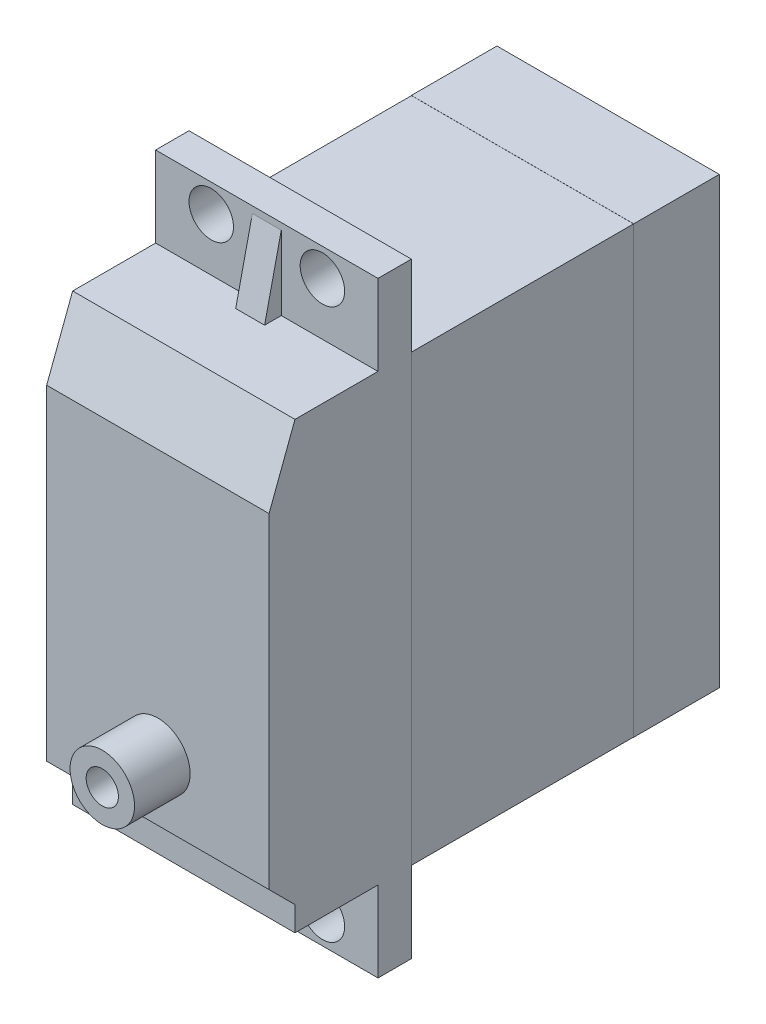
ISO-10303-21;
HEADER;
FILE_DESCRIPTION(('STEP AP214'),'2;1');
FILE_NAME('part.step','',(''),(''),'','','');
FILE_SCHEMA(('AUTOMOTIVE_DESIGN { 1 0 10303 214 1 1 1 1 }'));
ENDSEC;
DATA;
#1=APPLICATION_CONTEXT('core data for automotive mechanical design processes');
#2=APPLICATION_PROTOCOL_DEFINITION('international standard','automotive_design',2000,#1);
#3=PRODUCT_CONTEXT('',#1,'mechanical');
#4=PRODUCT('Part','Part','',(#3));
#5=PRODUCT_RELATED_PRODUCT_CATEGORY('part','',(#4));
#6=PRODUCT_DEFINITION_FORMATION('','',#4);
#7=PRODUCT_DEFINITION_CONTEXT('part definition',#1,'design');
#8=PRODUCT_DEFINITION('design','',#6,#7);
#9=PRODUCT_DEFINITION_SHAPE('','',#8);
#10=(LENGTH_UNIT() NAMED_UNIT(*) SI_UNIT(.MILLI.,.METRE.));
#11=(NAMED_UNIT(*) PLANE_ANGLE_UNIT() SI_UNIT($,.RADIAN.));
#12=(NAMED_UNIT(*) SI_UNIT($,.STERADIAN.) SOLID_ANGLE_UNIT());
#13=UNCERTAINTY_MEASURE_WITH_UNIT(LENGTH_MEASURE(1.E-05),#10,'distance_accuracy_value','');
#14=(GEOMETRIC_REPRESENTATION_CONTEXT(3) GLOBAL_UNCERTAINTY_ASSIGNED_CONTEXT((#13)) GLOBAL_UNIT_ASSIGNED_CONTEXT((#10,
#11,#12)) REPRESENTATION_CONTEXT('',''));
#15=CARTESIAN_POINT('',(0.,0.,0.));
#16=DIRECTION('',(0.,0.,1.));
#17=DIRECTION('',(1.,0.,0.));
#18=AXIS2_PLACEMENT_3D('',#15,#16,#17);
#19=CARTESIAN_POINT('',(-10.,20.,40.5));
#20=DIRECTION('',(0.,-1.,0.));
#21=DIRECTION('',(0.,0.,-1.));
#22=AXIS2_PLACEMENT_3D('',#19,#20,#21);
#23=PLANE('',#22);
#24=DIRECTION('',(0.,0.,-1.));
#25=VECTOR('',#24,1.);
#26=CARTESIAN_POINT('',(-1.3,20.,30.7));
#27=LINE('',#26,#25);
#28=CARTESIAN_POINT('',(-1.3,20.,32.2));
#29=VERTEX_POINT('',#28);
#30=CARTESIAN_POINT('',(-1.3,20.,30.7));
#31=VERTEX_POINT('',#30);
#32=EDGE_CURVE('E265',#29,#31,#27,.T.);
#33=ORIENTED_EDGE('',*,*,#32,.T.);
#34=DIRECTION('',(1.,0.,0.));
#35=VECTOR('',#34,1.);
#36=CARTESIAN_POINT('',(-17.8461774132376,20.,30.7));
#37=LINE('',#36,#35);
#38=CARTESIAN_POINT('',(-10.,20.,30.7));
#39=VERTEX_POINT('',#38);
#40=EDGE_CURVE('E382',#39,#31,#37,.T.);
#41=ORIENTED_EDGE('',*,*,#40,.F.);
#42=DIRECTION('',(0.,0.,-1.));
#43=VECTOR('',#42,1.);
#44=CARTESIAN_POINT('',(-10.,20.,40.5));
#45=LINE('',#44,#43);
#46=CARTESIAN_POINT('',(-10.,20.,38.1665476220844));
#47=VERTEX_POINT('',#46);
#48=EDGE_CURVE('E59',#47,#39,#45,.T.);
#49=ORIENTED_EDGE('',*,*,#48,.F.);
#50=DIRECTION('',(1.,0.,0.));
#51=VECTOR('',#50,1.);
#52=CARTESIAN_POINT('',(-16.6,20.,38.1665476220844));
#53=LINE('',#52,#51);
#54=CARTESIAN_POINT('',(10.,20.,38.1665476220844));
#55=VERTEX_POINT('',#54);
#56=EDGE_CURVE('E338',#47,#55,#53,.T.);
#57=ORIENTED_EDGE('',*,*,#56,.T.);
#58=DIRECTION('',(0.,0.,-1.));
#59=VECTOR('',#58,1.);
#60=CARTESIAN_POINT('',(10.,20.,40.5));
#61=LINE('',#60,#59);
#62=CARTESIAN_POINT('',(10.,20.,30.7));
#63=VERTEX_POINT('',#62);
#64=EDGE_CURVE('E430',#55,#63,#61,.T.);
#65=ORIENTED_EDGE('',*,*,#64,.T.);
#66=CARTESIAN_POINT('',(1.3,20.,30.7));
#67=VERTEX_POINT('',#66);
#68=EDGE_CURVE('E385',#67,#63,#37,.T.);
#69=ORIENTED_EDGE('',*,*,#68,.F.);
#70=DIRECTION('',(0.,0.,-1.));
#71=VECTOR('',#70,1.);
#72=CARTESIAN_POINT('',(1.3,20.,30.7));
#73=LINE('',#72,#71);
#74=CARTESIAN_POINT('',(1.3,20.,32.2));
#75=VERTEX_POINT('',#74);
#76=EDGE_CURVE('E71',#75,#67,#73,.T.);
#77=ORIENTED_EDGE('',*,*,#76,.F.);
#78=DIRECTION('',(1.,0.,0.));
#79=VECTOR('',#78,1.);
#80=CARTESIAN_POINT('',(-1.3,20.,32.2));
#81=LINE('',#80,#79);
#82=EDGE_CURVE('E66',#29,#75,#81,.T.);
#83=ORIENTED_EDGE('',*,*,#82,.F.);
#84=EDGE_LOOP('',(#33,#41,#49,#57,#65,#69,#77,#83));
#85=FACE_BOUND('',#84,.T.);
#86=ADVANCED_FACE('F51',(#85),#23,.F.);
#87=CARTESIAN_POINT('',(-10.,-20.,40.5));
#88=DIRECTION('',(0.,1.,0.));
#89=DIRECTION('',(-1.,0.,0.));
#90=AXIS2_PLACEMENT_3D('',#87,#88,#89);
#91=PLANE('',#90);
#92=DIRECTION('',(0.,0.,1.));
#93=VECTOR('',#92,1.);
#94=CARTESIAN_POINT('',(-1.3,-20.,32.2));
#95=LINE('',#94,#93);
#96=CARTESIAN_POINT('',(-1.3,-20.,30.7));
#97=VERTEX_POINT('',#96);
#98=CARTESIAN_POINT('',(-1.3,-20.,32.2));
#99=VERTEX_POINT('',#98);
#100=EDGE_CURVE('E248',#97,#99,#95,.T.);
#101=ORIENTED_EDGE('',*,*,#100,.T.);
#102=DIRECTION('',(1.,0.,0.));
#103=VECTOR('',#102,1.);
#104=CARTESIAN_POINT('',(-1.3,-20.,32.2));
#105=LINE('',#104,#103);
#106=CARTESIAN_POINT('',(1.3,-20.,32.2));
#107=VERTEX_POINT('',#106);
#108=EDGE_CURVE('E234',#99,#107,#105,.T.);
#109=ORIENTED_EDGE('',*,*,#108,.T.);
#110=DIRECTION('',(0.,0.,1.));
#111=VECTOR('',#110,1.);
#112=CARTESIAN_POINT('',(1.3,-20.,32.2));
#113=LINE('',#112,#111);
#114=CARTESIAN_POINT('',(1.3,-20.,30.7));
#115=VERTEX_POINT('',#114);
#116=EDGE_CURVE('E231',#115,#107,#113,.T.);
#117=ORIENTED_EDGE('',*,*,#116,.F.);
#118=DIRECTION('',(1.,0.,0.));
#119=VECTOR('',#118,1.);
#120=CARTESIAN_POINT('',(-17.8461774132376,-20.,30.7));
#121=LINE('',#120,#119);
#122=CARTESIAN_POINT('',(10.,-20.,30.7));
#123=VERTEX_POINT('',#122);
#124=EDGE_CURVE('E216',#115,#123,#121,.T.);
#125=ORIENTED_EDGE('',*,*,#124,.T.);
#126=DIRECTION('',(0.,0.,-1.));
#127=VECTOR('',#126,1.);
#128=CARTESIAN_POINT('',(10.,-20.,40.5));
#129=LINE('',#128,#127);
#130=CARTESIAN_POINT('',(10.,-20.,38.1665476220844));
#131=VERTEX_POINT('',#130);
#132=EDGE_CURVE('E434',#131,#123,#129,.T.);
#133=ORIENTED_EDGE('',*,*,#132,.F.);
#134=DIRECTION('',(1.,0.,0.));
#135=VECTOR('',#134,1.);
#136=CARTESIAN_POINT('',(-16.6,-20.,38.1665476220844));
#137=LINE('',#136,#135);
#138=CARTESIAN_POINT('',(-10.,-20.,38.1665476220844));
#139=VERTEX_POINT('',#138);
#140=EDGE_CURVE('E318',#139,#131,#137,.T.);
#141=ORIENTED_EDGE('',*,*,#140,.F.);
#142=DIRECTION('',(0.,0.,-1.));
#143=VECTOR('',#142,1.);
#144=CARTESIAN_POINT('',(-10.,-20.,40.5));
#145=LINE('',#144,#143);
#146=CARTESIAN_POINT('',(-10.,-20.,30.7));
#147=VERTEX_POINT('',#146);
#148=EDGE_CURVE('E437',#139,#147,#145,.T.);
#149=ORIENTED_EDGE('',*,*,#148,.T.);
#150=EDGE_CURVE('E227',#147,#97,#121,.T.);
#151=ORIENTED_EDGE('',*,*,#150,.T.);
#152=EDGE_LOOP('',(#101,#109,#117,#125,#133,#141,#149,#151));
#153=FACE_BOUND('',#152,.T.);
#154=ADVANCED_FACE('F232',(#153),#91,.F.);
#155=CARTESIAN_POINT('',(-17.8461774132376,-20.,30.7));
#156=DIRECTION('',(0.,0.,1.));
#157=DIRECTION('',(1.,0.,0.));
#158=AXIS2_PLACEMENT_3D('',#155,#156,#157);
#159=PLANE('',#158);
#160=CARTESIAN_POINT('',(-5.,-24.75,30.7));
#161=DIRECTION('',(0.,0.,1.));
#162=DIRECTION('',(1.,0.,0.));
#163=AXIS2_PLACEMENT_3D('',#160,#161,#162);
#164=CIRCLE('',#163,2.);
#165=CARTESIAN_POINT('',(-3.,-24.75,30.7));
#166=VERTEX_POINT('',#165);
#167=EDGE_CURVE('E361',#166,#166,#164,.T.);
#168=ORIENTED_EDGE('',*,*,#167,.F.);
#169=EDGE_LOOP('',(#168));
#170=FACE_BOUND('',#169,.T.);
#171=CARTESIAN_POINT('',(5.,-24.75,30.7));
#172=DIRECTION('',(0.,0.,1.));
#173=DIRECTION('',(1.,0.,0.));
#174=AXIS2_PLACEMENT_3D('',#171,#172,#173);
#175=CIRCLE('',#174,2.);
#176=CARTESIAN_POINT('',(7.,-24.75,30.7));
#177=VERTEX_POINT('',#176);
#178=EDGE_CURVE('E353',#177,#177,#175,.T.);
#179=ORIENTED_EDGE('',*,*,#178,.F.);
#180=EDGE_LOOP('',(#179));
#181=FACE_BOUND('',#180,.T.);
#182=DIRECTION('',(1.,0.,0.));
#183=VECTOR('',#182,1.);
#184=CARTESIAN_POINT('',(-1.3,-26.65,30.7));
#185=LINE('',#184,#183);
#186=CARTESIAN_POINT('',(-1.3,-26.65,30.7));
#187=VERTEX_POINT('',#186);
#188=CARTESIAN_POINT('',(1.3,-26.65,30.7));
#189=VERTEX_POINT('',#188);
#190=EDGE_CURVE('E253',#187,#189,#185,.T.);
#191=ORIENTED_EDGE('',*,*,#190,.F.);
#192=DIRECTION('',(0.,1.,0.));
#193=VECTOR('',#192,1.);
#194=CARTESIAN_POINT('',(-1.3,-20.,30.7));
#195=LINE('',#194,#193);
#196=EDGE_CURVE('E246',#187,#97,#195,.T.);
#197=ORIENTED_EDGE('',*,*,#196,.T.);
#198=ORIENTED_EDGE('',*,*,#150,.F.);
#199=DIRECTION('',(0.,1.,0.));
#200=VECTOR('',#199,1.);
#201=CARTESIAN_POINT('',(-10.,-20.,30.7));
#202=LINE('',#201,#200);
#203=CARTESIAN_POINT('',(-10.,-27.25,30.7));
#204=VERTEX_POINT('',#203);
#205=EDGE_CURVE('E399',#204,#147,#202,.T.);
#206=ORIENTED_EDGE('',*,*,#205,.F.);
#207=DIRECTION('',(1.,0.,0.));
#208=VECTOR('',#207,1.);
#209=CARTESIAN_POINT('',(-17.8461774132376,-27.25,30.7));
#210=LINE('',#209,#208);
#211=CARTESIAN_POINT('',(10.,-27.25,30.7));
#212=VERTEX_POINT('',#211);
#213=EDGE_CURVE('E406',#204,#212,#210,.T.);
#214=ORIENTED_EDGE('',*,*,#213,.T.);
#215=DIRECTION('',(0.,-1.,0.));
#216=VECTOR('',#215,1.);
#217=CARTESIAN_POINT('',(10.,-20.,30.7));
#218=LINE('',#217,#216);
#219=EDGE_CURVE('E223',#123,#212,#218,.T.);
#220=ORIENTED_EDGE('',*,*,#219,.F.);
#221=ORIENTED_EDGE('',*,*,#124,.F.);
#222=DIRECTION('',(0.,1.,0.));
#223=VECTOR('',#222,1.);
#224=CARTESIAN_POINT('',(1.3,-20.,30.7));
#225=LINE('',#224,#223);
#226=EDGE_CURVE('E220',#189,#115,#225,.T.);
#227=ORIENTED_EDGE('',*,*,#226,.F.);
#228=EDGE_LOOP('',(#191,#197,#198,#206,#214,#220,#221,#227));
#229=FACE_BOUND('',#228,.T.);
#230=ADVANCED_FACE('F218',(#170,#181,#229),#159,.T.);
#231=CARTESIAN_POINT('',(-17.8461774132376,20.,30.7));
#232=DIRECTION('',(0.,0.,1.));
#233=DIRECTION('',(1.,0.,0.));
#234=AXIS2_PLACEMENT_3D('',#231,#232,#233);
#235=PLANE('',#234);
#236=CARTESIAN_POINT('',(5.,24.75,30.7));
#237=DIRECTION('',(0.,0.,1.));
#238=DIRECTION('',(1.,0.,0.));
#239=AXIS2_PLACEMENT_3D('',#236,#237,#238);
#240=CIRCLE('',#239,2.);
#241=CARTESIAN_POINT('',(7.,24.75,30.7));
#242=VERTEX_POINT('',#241);
#243=EDGE_CURVE('E360',#242,#242,#240,.T.);
#244=ORIENTED_EDGE('',*,*,#243,.F.);
#245=EDGE_LOOP('',(#244));
#246=FACE_BOUND('',#245,.T.);
#247=CARTESIAN_POINT('',(-5.,24.75,30.7));
#248=DIRECTION('',(0.,0.,1.));
#249=DIRECTION('',(1.,0.,0.));
#250=AXIS2_PLACEMENT_3D('',#247,#248,#249);
#251=CIRCLE('',#250,2.);
#252=CARTESIAN_POINT('',(-3.,24.75,30.7));
#253=VERTEX_POINT('',#252);
#254=EDGE_CURVE('E364',#253,#253,#251,.T.);
#255=ORIENTED_EDGE('',*,*,#254,.F.);
#256=EDGE_LOOP('',(#255));
#257=FACE_BOUND('',#256,.T.);
#258=ORIENTED_EDGE('',*,*,#40,.T.);
#259=DIRECTION('',(0.,1.,0.));
#260=VECTOR('',#259,1.);
#261=CARTESIAN_POINT('',(-1.3,26.65,30.7));
#262=LINE('',#261,#260);
#263=CARTESIAN_POINT('',(-1.3,26.65,30.7));
#264=VERTEX_POINT('',#263);
#265=EDGE_CURVE('E263',#31,#264,#262,.T.);
#266=ORIENTED_EDGE('',*,*,#265,.T.);
#267=DIRECTION('',(1.,0.,0.));
#268=VECTOR('',#267,1.);
#269=CARTESIAN_POINT('',(-1.3,26.65,30.7));
#270=LINE('',#269,#268);
#271=CARTESIAN_POINT('',(1.3,26.65,30.7));
#272=VERTEX_POINT('',#271);
#273=EDGE_CURVE('E257',#264,#272,#270,.T.);
#274=ORIENTED_EDGE('',*,*,#273,.T.);
#275=DIRECTION('',(0.,1.,0.));
#276=VECTOR('',#275,1.);
#277=CARTESIAN_POINT('',(1.3,26.65,30.7));
#278=LINE('',#277,#276);
#279=EDGE_CURVE('E242',#67,#272,#278,.T.);
#280=ORIENTED_EDGE('',*,*,#279,.F.);
#281=ORIENTED_EDGE('',*,*,#68,.T.);
#282=DIRECTION('',(0.,-1.,0.));
#283=VECTOR('',#282,1.);
#284=CARTESIAN_POINT('',(10.,20.,30.7));
#285=LINE('',#284,#283);
#286=CARTESIAN_POINT('',(10.,27.25,30.7));
#287=VERTEX_POINT('',#286);
#288=EDGE_CURVE('E379',#287,#63,#285,.T.);
#289=ORIENTED_EDGE('',*,*,#288,.F.);
#290=DIRECTION('',(1.,0.,0.));
#291=VECTOR('',#290,1.);
#292=CARTESIAN_POINT('',(-17.8461774132376,27.25,30.7));
#293=LINE('',#292,#291);
#294=CARTESIAN_POINT('',(-10.,27.25,30.7));
#295=VERTEX_POINT('',#294);
#296=EDGE_CURVE('E380',#295,#287,#293,.T.);
#297=ORIENTED_EDGE('',*,*,#296,.F.);
#298=DIRECTION('',(0.,1.,0.));
#299=VECTOR('',#298,1.);
#300=CARTESIAN_POINT('',(-10.,20.,30.7));
#301=LINE('',#300,#299);
#302=EDGE_CURVE('E376',#39,#295,#301,.T.);
#303=ORIENTED_EDGE('',*,*,#302,.F.);
#304=EDGE_LOOP('',(#258,#266,#274,#280,#281,#289,#297,#303));
#305=FACE_BOUND('',#304,.T.);
#306=ADVANCED_FACE('F517',(#246,#257,#305),#235,.T.);
#307=CARTESIAN_POINT('',(-10.,-20.,40.5));
#308=DIRECTION('',(1.,0.,0.));
#309=DIRECTION('',(0.,0.,-1.));
#310=AXIS2_PLACEMENT_3D('',#307,#308,#309);
#311=PLANE('',#310);
#312=DIRECTION('',(0.,-1.,0.));
#313=VECTOR('',#312,1.);
#314=CARTESIAN_POINT('',(-10.,20.,27.7));
#315=LINE('',#314,#313);
#316=CARTESIAN_POINT('',(-10.,27.25,27.7));
#317=VERTEX_POINT('',#316);
#318=CARTESIAN_POINT('',(-10.,-27.25,27.7));
#319=VERTEX_POINT('',#318);
#320=EDGE_CURVE('E374',#317,#319,#315,.T.);
#321=ORIENTED_EDGE('',*,*,#320,.T.);
#322=DIRECTION('',(0.,0.,1.));
#323=VECTOR('',#322,1.);
#324=CARTESIAN_POINT('',(-10.,-27.25,30.7));
#325=LINE('',#324,#323);
#326=EDGE_CURVE('E397',#319,#204,#325,.T.);
#327=ORIENTED_EDGE('',*,*,#326,.T.);
#328=ORIENTED_EDGE('',*,*,#205,.T.);
#329=ORIENTED_EDGE('',*,*,#148,.F.);
#330=DIRECTION('',(0.,-1.,0.));
#331=VECTOR('',#330,1.);
#332=CARTESIAN_POINT('',(-10.,1.20301677890033E-13,38.1665476220843));
#333=LINE('',#332,#331);
#334=CARTESIAN_POINT('',(-10.,-17.7985874405663,38.1665476220844));
#335=VERTEX_POINT('',#334);
#336=EDGE_CURVE('E315',#335,#139,#333,.T.);
#337=ORIENTED_EDGE('',*,*,#336,.F.);
#338=DIRECTION('',(0.,-0.707106781186546,-0.707106781186549));
#339=VECTOR('',#338,1.);
#340=CARTESIAN_POINT('',(-10.,-27.9825675313254,27.9825675313253));
#341=LINE('',#340,#339);
#342=CARTESIAN_POINT('',(-10.,-15.4651350626507,40.5));
#343=VERTEX_POINT('',#342);
#344=EDGE_CURVE('E317',#343,#335,#341,.T.);
#345=ORIENTED_EDGE('',*,*,#344,.F.);
#346=DIRECTION('',(0.,-1.,0.));
#347=VECTOR('',#346,1.);
#348=CARTESIAN_POINT('',(-10.,-20.,40.5));
#349=LINE('',#348,#347);
#350=CARTESIAN_POINT('',(-10.,13.826265311823,40.5));
#351=VERTEX_POINT('',#350);
#352=EDGE_CURVE('E412',#351,#343,#349,.T.);
#353=ORIENTED_EDGE('',*,*,#352,.F.);
#354=DIRECTION('',(0.,0.935414346693486,-0.353553390593273));
#355=VECTOR('',#354,1.);
#356=CARTESIAN_POINT('',(-10.,15.1223991762423,40.0101074469853));
#357=LINE('',#356,#355);
#358=EDGE_CURVE('E323',#351,#47,#357,.T.);
#359=ORIENTED_EDGE('',*,*,#358,.T.);
#360=ORIENTED_EDGE('',*,*,#48,.T.);
#361=ORIENTED_EDGE('',*,*,#302,.T.);
#362=DIRECTION('',(0.,0.,-1.));
#363=VECTOR('',#362,1.);
#364=CARTESIAN_POINT('',(-10.,27.25,30.7));
#365=LINE('',#364,#363);
#366=EDGE_CURVE('E395',#295,#317,#365,.T.);
#367=ORIENTED_EDGE('',*,*,#366,.T.);
#368=EDGE_LOOP('',(#321,#327,#328,#329,#337,#345,#353,#359,#360,#361,#367));
#369=FACE_BOUND('',#368,.T.);
#370=ADVANCED_FACE('F509',(#369),#311,.F.);
#371=CARTESIAN_POINT('',(10.,-20.,40.5));
#372=DIRECTION('',(-1.,0.,0.));
#373=DIRECTION('',(0.,0.,1.));
#374=AXIS2_PLACEMENT_3D('',#371,#372,#373);
#375=PLANE('',#374);
#376=DIRECTION('',(0.,0.,-1.));
#377=VECTOR('',#376,1.);
#378=CARTESIAN_POINT('',(10.,-27.25,30.7));
#379=LINE('',#378,#377);
#380=CARTESIAN_POINT('',(10.,-27.25,27.7));
#381=VERTEX_POINT('',#380);
#382=EDGE_CURVE('E228',#212,#381,#379,.T.);
#383=ORIENTED_EDGE('',*,*,#382,.T.);
#384=DIRECTION('',(0.,1.,0.));
#385=VECTOR('',#384,1.);
#386=CARTESIAN_POINT('',(10.,20.,27.7));
#387=LINE('',#386,#385);
#388=CARTESIAN_POINT('',(10.,27.25,27.7));
#389=VERTEX_POINT('',#388);
#390=EDGE_CURVE('E391',#381,#389,#387,.T.);
#391=ORIENTED_EDGE('',*,*,#390,.T.);
#392=DIRECTION('',(0.,0.,1.));
#393=VECTOR('',#392,1.);
#394=CARTESIAN_POINT('',(10.,27.25,30.7));
#395=LINE('',#394,#393);
#396=EDGE_CURVE('E388',#389,#287,#395,.T.);
#397=ORIENTED_EDGE('',*,*,#396,.T.);
#398=ORIENTED_EDGE('',*,*,#288,.T.);
#399=ORIENTED_EDGE('',*,*,#64,.F.);
#400=DIRECTION('',(0.,-0.935414346693486,0.353553390593273));
#401=VECTOR('',#400,1.);
#402=CARTESIAN_POINT('',(10.,15.1223991762423,40.0101074469853));
#403=LINE('',#402,#401);
#404=CARTESIAN_POINT('',(10.,13.826265311823,40.5));
#405=VERTEX_POINT('',#404);
#406=EDGE_CURVE('E314',#55,#405,#403,.T.);
#407=ORIENTED_EDGE('',*,*,#406,.T.);
#408=DIRECTION('',(0.,1.,0.));
#409=VECTOR('',#408,1.);
#410=CARTESIAN_POINT('',(10.,-20.,40.5));
#411=LINE('',#410,#409);
#412=CARTESIAN_POINT('',(10.,-15.4651350626507,40.5));
#413=VERTEX_POINT('',#412);
#414=EDGE_CURVE('E415',#413,#405,#411,.T.);
#415=ORIENTED_EDGE('',*,*,#414,.F.);
#416=DIRECTION('',(0.,0.707106781186546,0.707106781186549));
#417=VECTOR('',#416,1.);
#418=CARTESIAN_POINT('',(10.,-27.9825675313254,27.9825675313253));
#419=LINE('',#418,#417);
#420=CARTESIAN_POINT('',(10.,-17.7985874405663,38.1665476220844));
#421=VERTEX_POINT('',#420);
#422=EDGE_CURVE('E322',#421,#413,#419,.T.);
#423=ORIENTED_EDGE('',*,*,#422,.F.);
#424=DIRECTION('',(0.,1.,0.));
#425=VECTOR('',#424,1.);
#426=CARTESIAN_POINT('',(10.,1.20301677890033E-13,38.1665476220843));
#427=LINE('',#426,#425);
#428=EDGE_CURVE('E319',#131,#421,#427,.T.);
#429=ORIENTED_EDGE('',*,*,#428,.F.);
#430=ORIENTED_EDGE('',*,*,#132,.T.);
#431=ORIENTED_EDGE('',*,*,#219,.T.);
#432=EDGE_LOOP('',(#383,#391,#397,#398,#399,#407,#415,#423,#429,#430,#431));
#433=FACE_BOUND('',#432,.T.);
#434=ADVANCED_FACE('F502',(#433),#375,.F.);
#435=CARTESIAN_POINT('',(0.,0.,40.5));
#436=DIRECTION('',(0.,0.,1.));
#437=DIRECTION('',(1.,0.,0.));
#438=AXIS2_PLACEMENT_3D('',#435,#436,#437);
#439=PLANE('',#438);
#440=DIRECTION('',(1.,0.,0.));
#441=VECTOR('',#440,1.);
#442=CARTESIAN_POINT('',(-16.6,-15.4651350626507,40.5));
#443=LINE('',#442,#441);
#444=EDGE_CURVE('E327',#343,#413,#443,.T.);
#445=ORIENTED_EDGE('',*,*,#444,.T.);
#446=ORIENTED_EDGE('',*,*,#414,.T.);
#447=DIRECTION('',(1.,0.,0.));
#448=VECTOR('',#447,1.);
#449=CARTESIAN_POINT('',(-16.6,13.826265311823,40.5));
#450=LINE('',#449,#448);
#451=EDGE_CURVE('E335',#351,#405,#450,.T.);
#452=ORIENTED_EDGE('',*,*,#451,.F.);
#453=ORIENTED_EDGE('',*,*,#352,.T.);
#454=EDGE_LOOP('',(#445,#446,#452,#453));
#455=FACE_BOUND('',#454,.T.);
#456=CARTESIAN_POINT('',(0.,-10.,40.5));
#457=DIRECTION('',(0.,0.,1.));
#458=DIRECTION('',(1.,0.,0.));
#459=AXIS2_PLACEMENT_3D('',#456,#457,#458);
#460=CIRCLE('',#459,2.9);
#461=CARTESIAN_POINT('',(2.9,-10.,40.5));
#462=VERTEX_POINT('',#461);
#463=EDGE_CURVE('E332',#462,#462,#460,.T.);
#464=ORIENTED_EDGE('',*,*,#463,.F.);
#465=EDGE_LOOP('',(#464));
#466=FACE_BOUND('',#465,.T.);
#467=ADVANCED_FACE('F522',(#455,#466),#439,.T.);
#468=CARTESIAN_POINT('',(-17.8461774132376,-27.25,30.7));
#469=DIRECTION('',(0.,-1.,0.));
#470=DIRECTION('',(0.,0.,-1.));
#471=AXIS2_PLACEMENT_3D('',#468,#469,#470);
#472=PLANE('',#471);
#473=ORIENTED_EDGE('',*,*,#326,.F.);
#474=DIRECTION('',(1.,0.,0.));
#475=VECTOR('',#474,1.);
#476=CARTESIAN_POINT('',(-17.8461774132376,-27.25,27.7));
#477=LINE('',#476,#475);
#478=EDGE_CURVE('E400',#319,#381,#477,.T.);
#479=ORIENTED_EDGE('',*,*,#478,.T.);
#480=ORIENTED_EDGE('',*,*,#382,.F.);
#481=ORIENTED_EDGE('',*,*,#213,.F.);
#482=EDGE_LOOP('',(#473,#479,#480,#481));
#483=FACE_BOUND('',#482,.T.);
#484=ADVANCED_FACE('F534',(#483),#472,.T.);
#485=CARTESIAN_POINT('',(-17.8461774132376,27.25,30.7));
#486=DIRECTION('',(0.,1.,0.));
#487=DIRECTION('',(0.,0.,1.));
#488=AXIS2_PLACEMENT_3D('',#485,#486,#487);
#489=PLANE('',#488);
#490=ORIENTED_EDGE('',*,*,#366,.F.);
#491=ORIENTED_EDGE('',*,*,#296,.T.);
#492=ORIENTED_EDGE('',*,*,#396,.F.);
#493=DIRECTION('',(1.,0.,0.));
#494=VECTOR('',#493,1.);
#495=CARTESIAN_POINT('',(-17.8461774132376,27.25,27.7));
#496=LINE('',#495,#494);
#497=EDGE_CURVE('E377',#317,#389,#496,.T.);
#498=ORIENTED_EDGE('',*,*,#497,.F.);
#499=EDGE_LOOP('',(#490,#491,#492,#498));
#500=FACE_BOUND('',#499,.T.);
#501=ADVANCED_FACE('F739',(#500),#489,.T.);
#502=CARTESIAN_POINT('',(-17.8461774132376,20.,27.7));
#503=DIRECTION('',(0.,0.,-1.));
#504=DIRECTION('',(-1.,0.,0.));
#505=AXIS2_PLACEMENT_3D('',#502,#503,#504);
#506=PLANE('',#505);
#507=CARTESIAN_POINT('',(5.,24.75,27.7));
#508=DIRECTION('',(0.,0.,-1.));
#509=DIRECTION('',(-1.,0.,0.));
#510=AXIS2_PLACEMENT_3D('',#507,#508,#509);
#511=CIRCLE('',#510,2.);
#512=CARTESIAN_POINT('',(3.,24.75,27.7));
#513=VERTEX_POINT('',#512);
#514=EDGE_CURVE('E357',#513,#513,#511,.F.);
#515=ORIENTED_EDGE('',*,*,#514,.T.);
#516=EDGE_LOOP('',(#515));
#517=FACE_BOUND('',#516,.T.);
#518=CARTESIAN_POINT('',(-5.,24.75,27.7));
#519=DIRECTION('',(0.,0.,-1.));
#520=DIRECTION('',(-1.,0.,0.));
#521=AXIS2_PLACEMENT_3D('',#518,#519,#520);
#522=CIRCLE('',#521,2.);
#523=CARTESIAN_POINT('',(-7.,24.75,27.7));
#524=VERTEX_POINT('',#523);
#525=EDGE_CURVE('E371',#524,#524,#522,.F.);
#526=ORIENTED_EDGE('',*,*,#525,.T.);
#527=EDGE_LOOP('',(#526));
#528=FACE_BOUND('',#527,.T.);
#529=ORIENTED_EDGE('',*,*,#320,.F.);
#530=ORIENTED_EDGE('',*,*,#497,.T.);
#531=ORIENTED_EDGE('',*,*,#390,.F.);
#532=ORIENTED_EDGE('',*,*,#478,.F.);
#533=EDGE_LOOP('',(#529,#530,#531,#532));
#534=FACE_BOUND('',#533,.T.);
#535=DIRECTION('',(0.,1.,0.));
#536=VECTOR('',#535,1.);
#537=CARTESIAN_POINT('',(-9.99,-19.99,27.7));
#538=LINE('',#537,#536);
#539=CARTESIAN_POINT('',(-9.99,-19.99,27.7));
#540=VERTEX_POINT('',#539);
#541=CARTESIAN_POINT('',(-9.99,19.99,27.7));
#542=VERTEX_POINT('',#541);
#543=EDGE_CURVE('E255',#540,#542,#538,.T.);
#544=ORIENTED_EDGE('',*,*,#543,.F.);
#545=DIRECTION('',(-1.,0.,0.));
#546=VECTOR('',#545,1.);
#547=CARTESIAN_POINT('',(9.99,-19.99,27.7));
#548=LINE('',#547,#546);
#549=CARTESIAN_POINT('',(9.99,-19.99,27.7));
#550=VERTEX_POINT('',#549);
#551=EDGE_CURVE('E275',#550,#540,#548,.T.);
#552=ORIENTED_EDGE('',*,*,#551,.F.);
#553=DIRECTION('',(0.,-1.,0.));
#554=VECTOR('',#553,1.);
#555=CARTESIAN_POINT('',(9.99,19.99,27.7));
#556=LINE('',#555,#554);
#557=CARTESIAN_POINT('',(9.99,19.99,27.7));
#558=VERTEX_POINT('',#557);
#559=EDGE_CURVE('E288',#558,#550,#556,.T.);
#560=ORIENTED_EDGE('',*,*,#559,.F.);
#561=DIRECTION('',(1.,0.,0.));
#562=VECTOR('',#561,1.);
#563=CARTESIAN_POINT('',(-9.99,19.99,27.7));
#564=LINE('',#563,#562);
#565=EDGE_CURVE('E285',#542,#558,#564,.T.);
#566=ORIENTED_EDGE('',*,*,#565,.F.);
#567=EDGE_LOOP('',(#544,#552,#560,#566));
#568=FACE_BOUND('',#567,.T.);
#569=CARTESIAN_POINT('',(-5.,-24.75,27.7));
#570=DIRECTION('',(0.,0.,-1.));
#571=DIRECTION('',(-1.,0.,0.));
#572=AXIS2_PLACEMENT_3D('',#569,#570,#571);
#573=CIRCLE('',#572,2.);
#574=CARTESIAN_POINT('',(-7.,-24.75,27.7));
#575=VERTEX_POINT('',#574);
#576=EDGE_CURVE('E356',#575,#575,#573,.F.);
#577=ORIENTED_EDGE('',*,*,#576,.T.);
#578=EDGE_LOOP('',(#577));
#579=FACE_BOUND('',#578,.T.);
#580=CARTESIAN_POINT('',(5.,-24.75,27.7));
#581=DIRECTION('',(0.,0.,-1.));
#582=DIRECTION('',(-1.,0.,0.));
#583=AXIS2_PLACEMENT_3D('',#580,#581,#582);
#584=CIRCLE('',#583,2.);
#585=CARTESIAN_POINT('',(3.,-24.75,27.7));
#586=VERTEX_POINT('',#585);
#587=EDGE_CURVE('E348',#586,#586,#584,.F.);
#588=ORIENTED_EDGE('',*,*,#587,.T.);
#589=EDGE_LOOP('',(#588));
#590=FACE_BOUND('',#589,.T.);
#591=ADVANCED_FACE('F482',(#517,#528,#534,#568,#579,#590),#506,.T.);
#592=CARTESIAN_POINT('',(-5.,24.75,22.0431457505076));
#593=DIRECTION('',(0.,0.,1.));
#594=DIRECTION('',(1.,0.,0.));
#595=AXIS2_PLACEMENT_3D('',#592,#593,#594);
#596=CYLINDRICAL_SURFACE('',#595,2.);
#597=ORIENTED_EDGE('',*,*,#254,.T.);
#598=EDGE_LOOP('',(#597));
#599=FACE_BOUND('',#598,.T.);
#600=ORIENTED_EDGE('',*,*,#525,.F.);
#601=EDGE_LOOP('',(#600));
#602=FACE_BOUND('',#601,.T.);
#603=ADVANCED_FACE('F738',(#599,#602),#596,.F.);
#604=CARTESIAN_POINT('',(5.,24.75,22.0431457505076));
#605=DIRECTION('',(0.,0.,1.));
#606=DIRECTION('',(1.,0.,0.));
#607=AXIS2_PLACEMENT_3D('',#604,#605,#606);
#608=CYLINDRICAL_SURFACE('',#607,2.);
#609=ORIENTED_EDGE('',*,*,#243,.T.);
#610=EDGE_LOOP('',(#609));
#611=FACE_BOUND('',#610,.T.);
#612=ORIENTED_EDGE('',*,*,#514,.F.);
#613=EDGE_LOOP('',(#612));
#614=FACE_BOUND('',#613,.T.);
#615=ADVANCED_FACE('F883',(#611,#614),#608,.F.);
#616=CARTESIAN_POINT('',(5.,-24.75,22.0431457505076));
#617=DIRECTION('',(0.,0.,1.));
#618=DIRECTION('',(1.,0.,0.));
#619=AXIS2_PLACEMENT_3D('',#616,#617,#618);
#620=CYLINDRICAL_SURFACE('',#619,2.);
#621=ORIENTED_EDGE('',*,*,#178,.T.);
#622=EDGE_LOOP('',(#621));
#623=FACE_BOUND('',#622,.T.);
#624=ORIENTED_EDGE('',*,*,#587,.F.);
#625=EDGE_LOOP('',(#624));
#626=FACE_BOUND('',#625,.T.);
#627=ADVANCED_FACE('F871',(#623,#626),#620,.F.);
#628=CARTESIAN_POINT('',(-5.,-24.75,22.0431457505076));
#629=DIRECTION('',(0.,0.,1.));
#630=DIRECTION('',(1.,0.,0.));
#631=AXIS2_PLACEMENT_3D('',#628,#629,#630);
#632=CYLINDRICAL_SURFACE('',#631,2.);
#633=ORIENTED_EDGE('',*,*,#167,.T.);
#634=EDGE_LOOP('',(#633));
#635=FACE_BOUND('',#634,.T.);
#636=ORIENTED_EDGE('',*,*,#576,.F.);
#637=EDGE_LOOP('',(#636));
#638=FACE_BOUND('',#637,.T.);
#639=ADVANCED_FACE('F859',(#635,#638),#632,.F.);
#640=CARTESIAN_POINT('',(0.,-10.,45.5));
#641=DIRECTION('',(0.,0.,-1.));
#642=DIRECTION('',(-1.,0.,0.));
#643=AXIS2_PLACEMENT_3D('',#640,#641,#642);
#644=CYLINDRICAL_SURFACE('',#643,1.45);
#645=CARTESIAN_POINT('',(0.,-10.,45.5));
#646=DIRECTION('',(0.,0.,1.));
#647=DIRECTION('',(1.,0.,0.));
#648=AXIS2_PLACEMENT_3D('',#645,#646,#647);
#649=CIRCLE('',#648,1.45);
#650=CARTESIAN_POINT('',(1.45,-10.,45.5));
#651=VERTEX_POINT('',#650);
#652=EDGE_CURVE('E342',#651,#651,#649,.T.);
#653=ORIENTED_EDGE('',*,*,#652,.T.);
#654=EDGE_LOOP('',(#653));
#655=FACE_BOUND('',#654,.T.);
#656=CARTESIAN_POINT('',(0.,-10.,40.5));
#657=DIRECTION('',(0.,0.,1.));
#658=DIRECTION('',(1.,0.,0.));
#659=AXIS2_PLACEMENT_3D('',#656,#657,#658);
#660=CIRCLE('',#659,1.45);
#661=CARTESIAN_POINT('',(1.45,-10.,40.5));
#662=VERTEX_POINT('',#661);
#663=EDGE_CURVE('E11',#662,#662,#660,.F.);
#664=ORIENTED_EDGE('',*,*,#663,.T.);
#665=EDGE_LOOP('',(#664));
#666=FACE_BOUND('',#665,.T.);
#667=ADVANCED_FACE('F847',(#655,#666),#644,.F.);
#668=CARTESIAN_POINT('',(0.,-10.,45.5));
#669=DIRECTION('',(0.,0.,-1.));
#670=DIRECTION('',(-1.,0.,0.));
#671=AXIS2_PLACEMENT_3D('',#668,#669,#670);
#672=CYLINDRICAL_SURFACE('',#671,2.9);
#673=CARTESIAN_POINT('',(0.,-10.,45.5));
#674=DIRECTION('',(0.,0.,1.));
#675=DIRECTION('',(1.,0.,0.));
#676=AXIS2_PLACEMENT_3D('',#673,#674,#675);
#677=CIRCLE('',#676,2.9);
#678=CARTESIAN_POINT('',(2.9,-10.,45.5));
#679=VERTEX_POINT('',#678);
#680=EDGE_CURVE('E345',#679,#679,#677,.T.);
#681=ORIENTED_EDGE('',*,*,#680,.F.);
#682=EDGE_LOOP('',(#681));
#683=FACE_BOUND('',#682,.T.);
#684=ORIENTED_EDGE('',*,*,#463,.T.);
#685=EDGE_LOOP('',(#684));
#686=FACE_BOUND('',#685,.T.);
#687=ADVANCED_FACE('F836',(#683,#686),#672,.T.);
#688=CARTESIAN_POINT('',(0.,0.,45.5));
#689=DIRECTION('',(0.,0.,1.));
#690=DIRECTION('',(1.,0.,0.));
#691=AXIS2_PLACEMENT_3D('',#688,#689,#690);
#692=PLANE('',#691);
#693=ORIENTED_EDGE('',*,*,#652,.F.);
#694=EDGE_LOOP('',(#693));
#695=FACE_BOUND('',#694,.T.);
#696=ORIENTED_EDGE('',*,*,#680,.T.);
#697=EDGE_LOOP('',(#696));
#698=FACE_BOUND('',#697,.T.);
#699=ADVANCED_FACE('F822',(#695,#698),#692,.T.);
#700=ORIENTED_EDGE('',*,*,#663,.F.);
#701=EDGE_LOOP('',(#700));
#702=FACE_BOUND('',#701,.T.);
#703=ADVANCED_FACE('F798',(#702),#439,.T.);
#704=CARTESIAN_POINT('',(-16.6,15.1223991762423,40.0101074469853));
#705=DIRECTION('',(0.,0.353553390593273,0.935414346693486));
#706=DIRECTION('',(0.,-0.935414346693486,0.353553390593273));
#707=AXIS2_PLACEMENT_3D('',#704,#705,#706);
#708=PLANE('',#707);
#709=ORIENTED_EDGE('',*,*,#451,.T.);
#710=ORIENTED_EDGE('',*,*,#406,.F.);
#711=ORIENTED_EDGE('',*,*,#56,.F.);
#712=ORIENTED_EDGE('',*,*,#358,.F.);
#713=EDGE_LOOP('',(#709,#710,#711,#712));
#714=FACE_BOUND('',#713,.T.);
#715=ADVANCED_FACE('F787',(#714),#708,.T.);
#716=CARTESIAN_POINT('',(-16.6,1.20301677890033E-13,38.1665476220843));
#717=DIRECTION('',(0.,0.,-1.));
#718=DIRECTION('',(0.,1.,0.));
#719=AXIS2_PLACEMENT_3D('',#716,#717,#718);
#720=PLANE('',#719);
#721=ORIENTED_EDGE('',*,*,#336,.T.);
#722=ORIENTED_EDGE('',*,*,#140,.T.);
#723=ORIENTED_EDGE('',*,*,#428,.T.);
#724=DIRECTION('',(1.,0.,0.));
#725=VECTOR('',#724,1.);
#726=CARTESIAN_POINT('',(-16.6,-17.7985874405663,38.1665476220844));
#727=LINE('',#726,#725);
#728=EDGE_CURVE('E325',#335,#421,#727,.T.);
#729=ORIENTED_EDGE('',*,*,#728,.F.);
#730=EDGE_LOOP('',(#721,#722,#723,#729));
#731=FACE_BOUND('',#730,.T.);
#732=ADVANCED_FACE('F774',(#731),#720,.F.);
#733=CARTESIAN_POINT('',(-16.6,-27.9825675313254,27.9825675313253));
#734=DIRECTION('',(0.,0.707106781186549,-0.707106781186546));
#735=DIRECTION('',(0.,0.707106781186546,0.707106781186549));
#736=AXIS2_PLACEMENT_3D('',#733,#734,#735);
#737=PLANE('',#736);
#738=ORIENTED_EDGE('',*,*,#344,.T.);
#739=ORIENTED_EDGE('',*,*,#728,.T.);
#740=ORIENTED_EDGE('',*,*,#422,.T.);
#741=ORIENTED_EDGE('',*,*,#444,.F.);
#742=EDGE_LOOP('',(#738,#739,#740,#741));
#743=FACE_BOUND('',#742,.T.);
#744=ADVANCED_FACE('F464',(#743),#737,.F.);
#745=CARTESIAN_POINT('',(0.,0.,7.69999999999999));
#746=DIRECTION('',(0.,0.,-1.));
#747=DIRECTION('',(-1.,0.,0.));
#748=AXIS2_PLACEMENT_3D('',#745,#746,#747);
#749=PLANE('',#748);
#750=DIRECTION('',(0.,1.,0.));
#751=VECTOR('',#750,1.);
#752=CARTESIAN_POINT('',(-10.,-20.,7.69999999999999));
#753=LINE('',#752,#751);
#754=CARTESIAN_POINT('',(-10.,-20.,7.69999999999999));
#755=VERTEX_POINT('',#754);
#756=CARTESIAN_POINT('',(-10.,20.,7.69999999999999));
#757=VERTEX_POINT('',#756);
#758=EDGE_CURVE('E302',#755,#757,#753,.T.);
#759=ORIENTED_EDGE('',*,*,#758,.F.);
#760=DIRECTION('',(-1.,0.,0.));
#761=VECTOR('',#760,1.);
#762=CARTESIAN_POINT('',(-10.,-20.,7.69999999999999));
#763=LINE('',#762,#761);
#764=CARTESIAN_POINT('',(10.,-20.,7.69999999999999));
#765=VERTEX_POINT('',#764);
#766=EDGE_CURVE('E311',#765,#755,#763,.T.);
#767=ORIENTED_EDGE('',*,*,#766,.F.);
#768=DIRECTION('',(0.,-1.,0.));
#769=VECTOR('',#768,1.);
#770=CARTESIAN_POINT('',(10.,-20.,7.69999999999999));
#771=LINE('',#770,#769);
#772=CARTESIAN_POINT('',(10.,20.,7.7));
#773=VERTEX_POINT('',#772);
#774=EDGE_CURVE('E308',#773,#765,#771,.T.);
#775=ORIENTED_EDGE('',*,*,#774,.F.);
#776=DIRECTION('',(1.,0.,0.));
#777=VECTOR('',#776,1.);
#778=CARTESIAN_POINT('',(-10.,20.,7.69999999999999));
#779=LINE('',#778,#777);
#780=EDGE_CURVE('E305',#757,#773,#779,.T.);
#781=ORIENTED_EDGE('',*,*,#780,.F.);
#782=EDGE_LOOP('',(#759,#767,#775,#781));
#783=FACE_BOUND('',#782,.T.);
#784=DIRECTION('',(1.,0.,0.));
#785=VECTOR('',#784,1.);
#786=CARTESIAN_POINT('',(-9.99,19.99,7.69999999999999));
#787=LINE('',#786,#785);
#788=CARTESIAN_POINT('',(-9.99,19.99,7.69999999999999));
#789=VERTEX_POINT('',#788);
#790=CARTESIAN_POINT('',(9.99,19.99,7.69999999999999));
#791=VERTEX_POINT('',#790);
#792=EDGE_CURVE('E274',#789,#791,#787,.T.);
#793=ORIENTED_EDGE('',*,*,#792,.T.);
#794=DIRECTION('',(0.,-1.,0.));
#795=VECTOR('',#794,1.);
#796=CARTESIAN_POINT('',(9.99,19.99,7.69999999999999));
#797=LINE('',#796,#795);
#798=CARTESIAN_POINT('',(9.99,-19.99,7.69999999999999));
#799=VERTEX_POINT('',#798);
#800=EDGE_CURVE('E277',#791,#799,#797,.T.);
#801=ORIENTED_EDGE('',*,*,#800,.T.);
#802=DIRECTION('',(-1.,0.,0.));
#803=VECTOR('',#802,1.);
#804=CARTESIAN_POINT('',(9.99,-19.99,7.69999999999999));
#805=LINE('',#804,#803);
#806=CARTESIAN_POINT('',(-9.99,-19.99,7.69999999999999));
#807=VERTEX_POINT('',#806);
#808=EDGE_CURVE('E280',#799,#807,#805,.T.);
#809=ORIENTED_EDGE('',*,*,#808,.T.);
#810=DIRECTION('',(0.,1.,0.));
#811=VECTOR('',#810,1.);
#812=CARTESIAN_POINT('',(-9.99,-19.99,7.69999999999999));
#813=LINE('',#812,#811);
#814=EDGE_CURVE('E272',#807,#789,#813,.T.);
#815=ORIENTED_EDGE('',*,*,#814,.T.);
#816=EDGE_LOOP('',(#793,#801,#809,#815));
#817=FACE_BOUND('',#816,.T.);
#818=ADVANCED_FACE('F460',(#783,#817),#749,.F.);
#819=CARTESIAN_POINT('',(-9.99,-19.99,7.69999999999999));
#820=DIRECTION('',(1.,0.,0.));
#821=DIRECTION('',(0.,0.,-1.));
#822=AXIS2_PLACEMENT_3D('',#819,#820,#821);
#823=PLANE('',#822);
#824=ORIENTED_EDGE('',*,*,#543,.T.);
#825=DIRECTION('',(0.,0.,1.));
#826=VECTOR('',#825,1.);
#827=CARTESIAN_POINT('',(-9.99,19.99,7.69999999999999));
#828=LINE('',#827,#826);
#829=EDGE_CURVE('E299',#789,#542,#828,.T.);
#830=ORIENTED_EDGE('',*,*,#829,.F.);
#831=ORIENTED_EDGE('',*,*,#814,.F.);
#832=DIRECTION('',(0.,0.,1.));
#833=VECTOR('',#832,1.);
#834=CARTESIAN_POINT('',(-9.99,-19.99,7.69999999999999));
#835=LINE('',#834,#833);
#836=EDGE_CURVE('E282',#807,#540,#835,.T.);
#837=ORIENTED_EDGE('',*,*,#836,.T.);
#838=EDGE_LOOP('',(#824,#830,#831,#837));
#839=FACE_BOUND('',#838,.T.);
#840=ADVANCED_FACE('F463',(#839),#823,.F.);
#841=CARTESIAN_POINT('',(-9.99,19.99,7.69999999999999));
#842=DIRECTION('',(0.,-1.,0.));
#843=DIRECTION('',(0.,0.,-1.));
#844=AXIS2_PLACEMENT_3D('',#841,#842,#843);
#845=PLANE('',#844);
#846=ORIENTED_EDGE('',*,*,#565,.T.);
#847=DIRECTION('',(0.,0.,1.));
#848=VECTOR('',#847,1.);
#849=CARTESIAN_POINT('',(9.99,19.99,7.69999999999999));
#850=LINE('',#849,#848);
#851=EDGE_CURVE('E297',#791,#558,#850,.T.);
#852=ORIENTED_EDGE('',*,*,#851,.F.);
#853=ORIENTED_EDGE('',*,*,#792,.F.);
#854=ORIENTED_EDGE('',*,*,#829,.T.);
#855=EDGE_LOOP('',(#846,#852,#853,#854));
#856=FACE_BOUND('',#855,.T.);
#857=ADVANCED_FACE('F473',(#856),#845,.F.);
#858=CARTESIAN_POINT('',(9.99,19.99,7.69999999999999));
#859=DIRECTION('',(-1.,0.,0.));
#860=DIRECTION('',(0.,0.,1.));
#861=AXIS2_PLACEMENT_3D('',#858,#859,#860);
#862=PLANE('',#861);
#863=ORIENTED_EDGE('',*,*,#559,.T.);
#864=DIRECTION('',(0.,0.,1.));
#865=VECTOR('',#864,1.);
#866=CARTESIAN_POINT('',(9.99,-19.99,7.69999999999999));
#867=LINE('',#866,#865);
#868=EDGE_CURVE('E295',#799,#550,#867,.T.);
#869=ORIENTED_EDGE('',*,*,#868,.F.);
#870=ORIENTED_EDGE('',*,*,#800,.F.);
#871=ORIENTED_EDGE('',*,*,#851,.T.);
#872=EDGE_LOOP('',(#863,#869,#870,#871));
#873=FACE_BOUND('',#872,.T.);
#874=ADVANCED_FACE('F476',(#873),#862,.F.);
#875=CARTESIAN_POINT('',(9.99,-19.99,7.69999999999999));
#876=DIRECTION('',(0.,1.,0.));
#877=DIRECTION('',(-1.,0.,0.));
#878=AXIS2_PLACEMENT_3D('',#875,#876,#877);
#879=PLANE('',#878);
#880=ORIENTED_EDGE('',*,*,#551,.T.);
#881=ORIENTED_EDGE('',*,*,#836,.F.);
#882=ORIENTED_EDGE('',*,*,#808,.F.);
#883=ORIENTED_EDGE('',*,*,#868,.T.);
#884=EDGE_LOOP('',(#880,#881,#882,#883));
#885=FACE_BOUND('',#884,.T.);
#886=ADVANCED_FACE('F479',(#885),#879,.F.);
#887=CARTESIAN_POINT('',(0.,0.,0.));
#888=DIRECTION('',(0.,0.,1.));
#889=DIRECTION('',(1.,0.,0.));
#890=AXIS2_PLACEMENT_3D('',#887,#888,#889);
#891=PLANE('',#890);
#892=DIRECTION('',(-1.,0.,0.));
#893=VECTOR('',#892,1.);
#894=CARTESIAN_POINT('',(-10.,20.,0.));
#895=LINE('',#894,#893);
#896=CARTESIAN_POINT('',(10.,20.,0.));
#897=VERTEX_POINT('',#896);
#898=CARTESIAN_POINT('',(-10.,20.,0.));
#899=VERTEX_POINT('',#898);
#900=EDGE_CURVE('E411',#897,#899,#895,.T.);
#901=ORIENTED_EDGE('',*,*,#900,.F.);
#902=DIRECTION('',(0.,1.,0.));
#903=VECTOR('',#902,1.);
#904=CARTESIAN_POINT('',(10.,-20.,0.));
#905=LINE('',#904,#903);
#906=CARTESIAN_POINT('',(10.,-20.,0.));
#907=VERTEX_POINT('',#906);
#908=EDGE_CURVE('E416',#907,#897,#905,.T.);
#909=ORIENTED_EDGE('',*,*,#908,.F.);
#910=DIRECTION('',(1.,0.,0.));
#911=VECTOR('',#910,1.);
#912=CARTESIAN_POINT('',(-10.,-20.,0.));
#913=LINE('',#912,#911);
#914=CARTESIAN_POINT('',(-10.,-20.,0.));
#915=VERTEX_POINT('',#914);
#916=EDGE_CURVE('E425',#915,#907,#913,.T.);
#917=ORIENTED_EDGE('',*,*,#916,.F.);
#918=DIRECTION('',(0.,-1.,0.));
#919=VECTOR('',#918,1.);
#920=CARTESIAN_POINT('',(-10.,-20.,0.));
#921=LINE('',#920,#919);
#922=EDGE_CURVE('E422',#899,#915,#921,.T.);
#923=ORIENTED_EDGE('',*,*,#922,.F.);
#924=EDGE_LOOP('',(#901,#909,#917,#923));
#925=FACE_BOUND('',#924,.T.);
#926=ADVANCED_FACE('F451',(#925),#891,.F.);
#927=EDGE_CURVE('E433',#765,#907,#129,.T.);
#928=ORIENTED_EDGE('',*,*,#927,.F.);
#929=ORIENTED_EDGE('',*,*,#766,.T.);
#930=EDGE_CURVE('E436',#755,#915,#145,.T.);
#931=ORIENTED_EDGE('',*,*,#930,.T.);
#932=ORIENTED_EDGE('',*,*,#916,.T.);
#933=EDGE_LOOP('',(#928,#929,#931,#932));
#934=FACE_BOUND('',#933,.T.);
#935=ADVANCED_FACE('F458',(#934),#91,.F.);
#936=EDGE_CURVE('E438',#757,#899,#45,.T.);
#937=ORIENTED_EDGE('',*,*,#936,.F.);
#938=ORIENTED_EDGE('',*,*,#780,.T.);
#939=EDGE_CURVE('E419',#773,#897,#61,.T.);
#940=ORIENTED_EDGE('',*,*,#939,.T.);
#941=ORIENTED_EDGE('',*,*,#900,.T.);
#942=EDGE_LOOP('',(#937,#938,#940,#941));
#943=FACE_BOUND('',#942,.T.);
#944=ADVANCED_FACE('F53',(#943),#23,.F.);
#945=ORIENTED_EDGE('',*,*,#939,.F.);
#946=ORIENTED_EDGE('',*,*,#774,.T.);
#947=ORIENTED_EDGE('',*,*,#927,.T.);
#948=ORIENTED_EDGE('',*,*,#908,.T.);
#949=EDGE_LOOP('',(#945,#946,#947,#948));
#950=FACE_BOUND('',#949,.T.);
#951=ADVANCED_FACE('F455',(#950),#375,.F.);
#952=ORIENTED_EDGE('',*,*,#930,.F.);
#953=ORIENTED_EDGE('',*,*,#758,.T.);
#954=ORIENTED_EDGE('',*,*,#936,.T.);
#955=ORIENTED_EDGE('',*,*,#922,.T.);
#956=EDGE_LOOP('',(#952,#953,#954,#955));
#957=FACE_BOUND('',#956,.T.);
#958=ADVANCED_FACE('F446',(#957),#311,.F.);
#959=CARTESIAN_POINT('',(-1.3,20.,32.2));
#960=DIRECTION('',(0.,0.220035746488242,0.975491809431203));
#961=DIRECTION('',(0.,-0.975491809431203,0.220035746488242));
#962=AXIS2_PLACEMENT_3D('',#959,#960,#961);
#963=PLANE('',#962);
#964=ORIENTED_EDGE('',*,*,#82,.T.);
#965=DIRECTION('',(0.,-0.975491809431203,0.220035746488242));
#966=VECTOR('',#965,1.);
#967=CARTESIAN_POINT('',(1.3,20.,32.2));
#968=LINE('',#967,#966);
#969=EDGE_CURVE('E267',#272,#75,#968,.T.);
#970=ORIENTED_EDGE('',*,*,#969,.F.);
#971=ORIENTED_EDGE('',*,*,#273,.F.);
#972=DIRECTION('',(0.,-0.975491809431203,0.220035746488242));
#973=VECTOR('',#972,1.);
#974=CARTESIAN_POINT('',(-1.3,20.,32.2));
#975=LINE('',#974,#973);
#976=EDGE_CURVE('E259',#264,#29,#975,.T.);
#977=ORIENTED_EDGE('',*,*,#976,.T.);
#978=EDGE_LOOP('',(#964,#970,#971,#977));
#979=FACE_BOUND('',#978,.T.);
#980=ADVANCED_FACE('F508',(#979),#963,.T.);
#981=CARTESIAN_POINT('',(-1.3,0.,0.));
#982=DIRECTION('',(1.,0.,0.));
#983=DIRECTION('',(0.,0.,-1.));
#984=AXIS2_PLACEMENT_3D('',#981,#982,#983);
#985=PLANE('',#984);
#986=ORIENTED_EDGE('',*,*,#32,.F.);
#987=ORIENTED_EDGE('',*,*,#976,.F.);
#988=ORIENTED_EDGE('',*,*,#265,.F.);
#989=EDGE_LOOP('',(#986,#987,#988));
#990=FACE_BOUND('',#989,.T.);
#991=ADVANCED_FACE('F513',(#990),#985,.F.);
#992=CARTESIAN_POINT('',(1.3,0.,0.));
#993=DIRECTION('',(1.,0.,0.));
#994=DIRECTION('',(0.,0.,-1.));
#995=AXIS2_PLACEMENT_3D('',#992,#993,#994);
#996=PLANE('',#995);
#997=ORIENTED_EDGE('',*,*,#76,.T.);
#998=ORIENTED_EDGE('',*,*,#279,.T.);
#999=ORIENTED_EDGE('',*,*,#969,.T.);
#1000=EDGE_LOOP('',(#997,#998,#999));
#1001=FACE_BOUND('',#1000,.T.);
#1002=ADVANCED_FACE('F555',(#1001),#996,.T.);
#1003=CARTESIAN_POINT('',(-1.3,-26.65,30.7));
#1004=DIRECTION('',(0.,-0.220035746488242,0.975491809431203));
#1005=DIRECTION('',(0.,-0.975491809431203,-0.220035746488242));
#1006=AXIS2_PLACEMENT_3D('',#1003,#1004,#1005);
#1007=PLANE('',#1006);
#1008=ORIENTED_EDGE('',*,*,#190,.T.);
#1009=DIRECTION('',(0.,-0.975491809431203,-0.220035746488241));
#1010=VECTOR('',#1009,1.);
#1011=CARTESIAN_POINT('',(1.3,-26.65,30.7));
#1012=LINE('',#1011,#1010);
#1013=EDGE_CURVE('E238',#107,#189,#1012,.T.);
#1014=ORIENTED_EDGE('',*,*,#1013,.F.);
#1015=ORIENTED_EDGE('',*,*,#108,.F.);
#1016=DIRECTION('',(0.,-0.975491809431203,-0.220035746488241));
#1017=VECTOR('',#1016,1.);
#1018=CARTESIAN_POINT('',(-1.3,-26.65,30.7));
#1019=LINE('',#1018,#1017);
#1020=EDGE_CURVE('E250',#99,#187,#1019,.T.);
#1021=ORIENTED_EDGE('',*,*,#1020,.T.);
#1022=EDGE_LOOP('',(#1008,#1014,#1015,#1021));
#1023=FACE_BOUND('',#1022,.T.);
#1024=ADVANCED_FACE('F553',(#1023),#1007,.T.);
#1025=CARTESIAN_POINT('',(-1.3,0.,0.));
#1026=DIRECTION('',(1.,0.,0.));
#1027=DIRECTION('',(0.,0.,-1.));
#1028=AXIS2_PLACEMENT_3D('',#1025,#1026,#1027);
#1029=PLANE('',#1028);
#1030=ORIENTED_EDGE('',*,*,#196,.F.);
#1031=ORIENTED_EDGE('',*,*,#1020,.F.);
#1032=ORIENTED_EDGE('',*,*,#100,.F.);
#1033=EDGE_LOOP('',(#1030,#1031,#1032));
#1034=FACE_BOUND('',#1033,.T.);
#1035=ADVANCED_FACE('F551',(#1034),#1029,.F.);
#1036=CARTESIAN_POINT('',(1.3,0.,0.));
#1037=DIRECTION('',(1.,0.,0.));
#1038=DIRECTION('',(0.,0.,-1.));
#1039=AXIS2_PLACEMENT_3D('',#1036,#1037,#1038);
#1040=PLANE('',#1039);
#1041=ORIENTED_EDGE('',*,*,#226,.T.);
#1042=ORIENTED_EDGE('',*,*,#116,.T.);
#1043=ORIENTED_EDGE('',*,*,#1013,.T.);
#1044=EDGE_LOOP('',(#1041,#1042,#1043));
#1045=FACE_BOUND('',#1044,.T.);
#1046=ADVANCED_FACE('F240',(#1045),#1040,.T.);
#1047=CLOSED_SHELL('',(#86,#154,#230,#306,#370,#434,#467,#484,#501,#591,#603,#615,#627,#639,
#667,#687,#699,#703,#715,#732,#744,#818,#840,#857,#874,#886,#926,#935,#944,#951,#958,#980,#991,
#1002,#1024,#1035,#1046));
#1048=MANIFOLD_SOLID_BREP('B2',#1047);
#1049=ADVANCED_BREP_SHAPE_REPRESENTATION('',(#18,#1048),#14);
#1050=SHAPE_DEFINITION_REPRESENTATION(#9,#1049);
ENDSEC;
END-ISO-10303-21;
